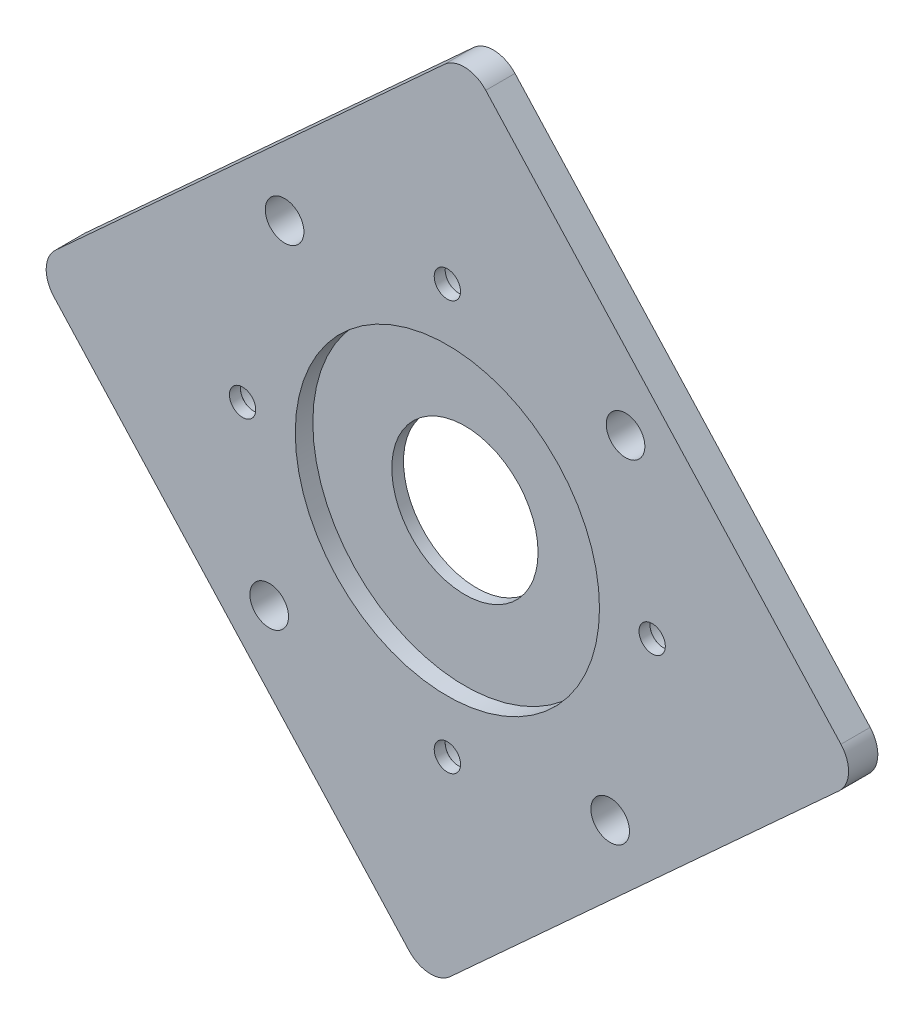
ISO-10303-21;
HEADER;
FILE_DESCRIPTION(('STEP AP214'),'2;1');
FILE_NAME('part.step','',(''),(''),'','','');
FILE_SCHEMA(('AUTOMOTIVE_DESIGN { 1 0 10303 214 1 1 1 1 }'));
ENDSEC;
DATA;
#1=APPLICATION_CONTEXT('core data for automotive mechanical design processes');
#2=APPLICATION_PROTOCOL_DEFINITION('international standard','automotive_design',2000,#1);
#3=PRODUCT_CONTEXT('',#1,'mechanical');
#4=PRODUCT('Part','Part','',(#3));
#5=PRODUCT_RELATED_PRODUCT_CATEGORY('part','',(#4));
#6=PRODUCT_DEFINITION_FORMATION('','',#4);
#7=PRODUCT_DEFINITION_CONTEXT('part definition',#1,'design');
#8=PRODUCT_DEFINITION('design','',#6,#7);
#9=PRODUCT_DEFINITION_SHAPE('','',#8);
#10=(LENGTH_UNIT() NAMED_UNIT(*) SI_UNIT(.MILLI.,.METRE.));
#11=(NAMED_UNIT(*) PLANE_ANGLE_UNIT() SI_UNIT($,.RADIAN.));
#12=(NAMED_UNIT(*) SI_UNIT($,.STERADIAN.) SOLID_ANGLE_UNIT());
#13=UNCERTAINTY_MEASURE_WITH_UNIT(LENGTH_MEASURE(1.E-05),#10,'distance_accuracy_value','');
#14=(GEOMETRIC_REPRESENTATION_CONTEXT(3) GLOBAL_UNCERTAINTY_ASSIGNED_CONTEXT((#13)) GLOBAL_UNIT_ASSIGNED_CONTEXT((#10,
#11,#12)) REPRESENTATION_CONTEXT('',''));
#15=CARTESIAN_POINT('',(0.,0.,0.));
#16=DIRECTION('',(0.,0.,1.));
#17=DIRECTION('',(1.,0.,0.));
#18=AXIS2_PLACEMENT_3D('',#15,#16,#17);
#19=CARTESIAN_POINT('',(0.,0.,5.));
#20=DIRECTION('',(0.,0.,1.));
#21=DIRECTION('',(1.,0.,0.));
#22=AXIS2_PLACEMENT_3D('',#19,#20,#21);
#23=PLANE('',#22);
#24=CARTESIAN_POINT('',(30.4526604909076,27.8244131838484,5.));
#25=DIRECTION('',(0.,0.,1.));
#26=DIRECTION('',(1.,0.,0.));
#27=AXIS2_PLACEMENT_3D('',#24,#25,#26);
#28=CIRCLE('',#27,3.29999999999998);
#29=CARTESIAN_POINT('',(33.7526604909076,27.8244131838484,5.));
#30=VERTEX_POINT('',#29);
#31=EDGE_CURVE('E177',#30,#30,#28,.T.);
#32=ORIENTED_EDGE('',*,*,#31,.F.);
#33=EDGE_LOOP('',(#32));
#34=FACE_BOUND('',#33,.T.);
#35=CARTESIAN_POINT('',(-27.8244131838484,30.4526604909076,5.));
#36=DIRECTION('',(0.,0.,1.));
#37=DIRECTION('',(1.,0.,0.));
#38=AXIS2_PLACEMENT_3D('',#35,#36,#37);
#39=CIRCLE('',#38,3.29999999999999);
#40=CARTESIAN_POINT('',(-24.5244131838484,30.4526604909076,5.));
#41=VERTEX_POINT('',#40);
#42=EDGE_CURVE('E184',#41,#41,#39,.T.);
#43=ORIENTED_EDGE('',*,*,#42,.F.);
#44=EDGE_LOOP('',(#43));
#45=FACE_BOUND('',#44,.T.);
#46=CARTESIAN_POINT('',(-30.4526604909076,-27.8244131838484,5.));
#47=DIRECTION('',(0.,0.,1.));
#48=DIRECTION('',(1.,0.,0.));
#49=AXIS2_PLACEMENT_3D('',#46,#47,#48);
#50=CIRCLE('',#49,3.29999999999999);
#51=CARTESIAN_POINT('',(-27.1526604909076,-27.8244131838484,5.));
#52=VERTEX_POINT('',#51);
#53=EDGE_CURVE('E190',#52,#52,#50,.T.);
#54=ORIENTED_EDGE('',*,*,#53,.F.);
#55=EDGE_LOOP('',(#54));
#56=FACE_BOUND('',#55,.T.);
#57=CARTESIAN_POINT('',(27.8244131838484,-30.4526604909076,5.));
#58=DIRECTION('',(0.,0.,1.));
#59=DIRECTION('',(1.,0.,0.));
#60=AXIS2_PLACEMENT_3D('',#57,#58,#59);
#61=CIRCLE('',#60,3.29999999999999);
#62=CARTESIAN_POINT('',(31.1244131838484,-30.4526604909076,5.));
#63=VERTEX_POINT('',#62);
#64=EDGE_CURVE('E196',#63,#63,#61,.T.);
#65=ORIENTED_EDGE('',*,*,#64,.F.);
#66=EDGE_LOOP('',(#65));
#67=FACE_BOUND('',#66,.T.);
#68=CARTESIAN_POINT('',(0.,35.,5.));
#69=DIRECTION('',(0.,0.,-1.));
#70=DIRECTION('',(-1.,0.,0.));
#71=AXIS2_PLACEMENT_3D('',#68,#69,#70);
#72=CIRCLE('',#71,2.25);
#73=CARTESIAN_POINT('',(-2.25,35.,5.));
#74=VERTEX_POINT('',#73);
#75=EDGE_CURVE('E214',#74,#74,#72,.T.);
#76=ORIENTED_EDGE('',*,*,#75,.T.);
#77=EDGE_LOOP('',(#76));
#78=FACE_BOUND('',#77,.T.);
#79=CARTESIAN_POINT('',(-35.,0.,5.));
#80=DIRECTION('',(0.,0.,-1.));
#81=DIRECTION('',(-1.,0.,0.));
#82=AXIS2_PLACEMENT_3D('',#79,#80,#81);
#83=CIRCLE('',#82,2.25);
#84=CARTESIAN_POINT('',(-37.25,0.,5.));
#85=VERTEX_POINT('',#84);
#86=EDGE_CURVE('E229',#85,#85,#83,.T.);
#87=ORIENTED_EDGE('',*,*,#86,.T.);
#88=EDGE_LOOP('',(#87));
#89=FACE_BOUND('',#88,.T.);
#90=CARTESIAN_POINT('',(0.,-35.,5.));
#91=DIRECTION('',(0.,0.,-1.));
#92=DIRECTION('',(-1.,0.,0.));
#93=AXIS2_PLACEMENT_3D('',#90,#91,#92);
#94=CIRCLE('',#93,2.25);
#95=CARTESIAN_POINT('',(-2.25,-35.,5.));
#96=VERTEX_POINT('',#95);
#97=EDGE_CURVE('E244',#96,#96,#94,.T.);
#98=ORIENTED_EDGE('',*,*,#97,.T.);
#99=EDGE_LOOP('',(#98));
#100=FACE_BOUND('',#99,.T.);
#101=CARTESIAN_POINT('',(35.,0.,5.));
#102=DIRECTION('',(0.,0.,-1.));
#103=DIRECTION('',(-1.,0.,0.));
#104=AXIS2_PLACEMENT_3D('',#101,#102,#103);
#105=CIRCLE('',#104,2.25);
#106=CARTESIAN_POINT('',(32.75,0.,5.));
#107=VERTEX_POINT('',#106);
#108=EDGE_CURVE('E259',#107,#107,#105,.T.);
#109=ORIENTED_EDGE('',*,*,#108,.T.);
#110=EDGE_LOOP('',(#109));
#111=FACE_BOUND('',#110,.T.);
#112=CARTESIAN_POINT('',(0.,0.,5.));
#113=DIRECTION('',(0.,0.,1.));
#114=DIRECTION('',(1.,0.,0.));
#115=AXIS2_PLACEMENT_3D('',#112,#113,#114);
#116=CIRCLE('',#115,26.);
#117=CARTESIAN_POINT('',(26.,0.,5.));
#118=VERTEX_POINT('',#117);
#119=EDGE_CURVE('E93',#118,#118,#116,.T.);
#120=ORIENTED_EDGE('',*,*,#119,.F.);
#121=EDGE_LOOP('',(#120));
#122=FACE_BOUND('',#121,.T.);
#123=DIRECTION('',(-0.674531228699354,0.738246314931094,0.));
#124=VECTOR('',#123,1.);
#125=CARTESIAN_POINT('',(-36.9123157465547,-33.7265614349677,5.));
#126=LINE('',#125,#124);
#127=CARTESIAN_POINT('',(-6.55841045508376,-66.9476456068669,5.));
#128=VERTEX_POINT('',#127);
#129=CARTESIAN_POINT('',(-67.2662210380256,-0.505477263068529,5.));
#130=VERTEX_POINT('',#129);
#131=EDGE_CURVE('E161',#128,#130,#126,.T.);
#132=ORIENTED_EDGE('',*,*,#131,.F.);
#133=CARTESIAN_POINT('',(-2.86717888042828,-63.5749894633702,5.));
#134=DIRECTION('',(0.,0.,-1.));
#135=DIRECTION('',(-1.,0.,0.));
#136=AXIS2_PLACEMENT_3D('',#133,#134,#135);
#137=CIRCLE('',#136,5.);
#138=CARTESIAN_POINT('',(0.505477263068516,-67.2662210380256,5.));
#139=VERTEX_POINT('',#138);
#140=EDGE_CURVE('E361',#139,#128,#137,.T.);
#141=ORIENTED_EDGE('',*,*,#140,.F.);
#142=DIRECTION('',(-0.738246314931094,-0.674531228699354,0.));
#143=VECTOR('',#142,1.);
#144=CARTESIAN_POINT('',(33.7265614349677,-36.9123157465547,5.));
#145=LINE('',#144,#143);
#146=CARTESIAN_POINT('',(66.9476456068669,-6.55841045508376,5.));
#147=VERTEX_POINT('',#146);
#148=EDGE_CURVE('E357',#147,#139,#145,.T.);
#149=ORIENTED_EDGE('',*,*,#148,.F.);
#150=CARTESIAN_POINT('',(63.5749894633702,-2.86717888042828,5.));
#151=DIRECTION('',(0.,0.,-1.));
#152=DIRECTION('',(-1.,0.,0.));
#153=AXIS2_PLACEMENT_3D('',#150,#151,#152);
#154=CIRCLE('',#153,4.99999999999999);
#155=CARTESIAN_POINT('',(67.2662210380256,0.505477263068516,5.));
#156=VERTEX_POINT('',#155);
#157=EDGE_CURVE('E152',#156,#147,#154,.T.);
#158=ORIENTED_EDGE('',*,*,#157,.F.);
#159=DIRECTION('',(0.674531228699354,-0.738246314931094,0.));
#160=VECTOR('',#159,1.);
#161=CARTESIAN_POINT('',(36.9123157465547,33.7265614349677,5.));
#162=LINE('',#161,#160);
#163=CARTESIAN_POINT('',(6.55841045508377,66.9476456068669,5.));
#164=VERTEX_POINT('',#163);
#165=EDGE_CURVE('E138',#164,#156,#162,.T.);
#166=ORIENTED_EDGE('',*,*,#165,.F.);
#167=CARTESIAN_POINT('',(2.86717888042827,63.5749894633701,5.));
#168=DIRECTION('',(0.,0.,-1.));
#169=DIRECTION('',(-1.,0.,0.));
#170=AXIS2_PLACEMENT_3D('',#167,#168,#169);
#171=CIRCLE('',#170,4.99999999999999);
#172=CARTESIAN_POINT('',(-0.505477263068522,67.2662210380256,5.));
#173=VERTEX_POINT('',#172);
#174=EDGE_CURVE('E144',#173,#164,#171,.T.);
#175=ORIENTED_EDGE('',*,*,#174,.F.);
#176=DIRECTION('',(0.738246314931094,0.674531228699354,0.));
#177=VECTOR('',#176,1.);
#178=CARTESIAN_POINT('',(-33.7265614349677,36.9123157465547,5.));
#179=LINE('',#178,#177);
#180=CARTESIAN_POINT('',(-66.9476456068669,6.55841045508377,5.));
#181=VERTEX_POINT('',#180);
#182=EDGE_CURVE('E167',#181,#173,#179,.T.);
#183=ORIENTED_EDGE('',*,*,#182,.F.);
#184=CARTESIAN_POINT('',(-63.5749894633702,2.86717888042827,5.));
#185=DIRECTION('',(0.,0.,-1.));
#186=DIRECTION('',(-1.,0.,0.));
#187=AXIS2_PLACEMENT_3D('',#184,#185,#186);
#188=CIRCLE('',#187,4.99999999999999);
#189=EDGE_CURVE('E163',#130,#181,#188,.T.);
#190=ORIENTED_EDGE('',*,*,#189,.F.);
#191=EDGE_LOOP('',(#132,#141,#149,#158,#166,#175,#183,#190));
#192=FACE_BOUND('',#191,.T.);
#193=ADVANCED_FACE('F83',(#34,#45,#56,#67,#78,#89,#100,#111,#122,#192),#23,.T.);
#194=CARTESIAN_POINT('',(0.,0.,0.));
#195=DIRECTION('',(0.,0.,1.));
#196=DIRECTION('',(1.,0.,0.));
#197=AXIS2_PLACEMENT_3D('',#194,#195,#196);
#198=PLANE('',#197);
#199=CARTESIAN_POINT('',(30.4526604909076,27.8244131838484,0.));
#200=DIRECTION('',(0.,0.,1.));
#201=DIRECTION('',(1.,0.,0.));
#202=AXIS2_PLACEMENT_3D('',#199,#200,#201);
#203=CIRCLE('',#202,3.29999999999998);
#204=CARTESIAN_POINT('',(33.7526604909076,27.8244131838484,0.));
#205=VERTEX_POINT('',#204);
#206=EDGE_CURVE('E181',#205,#205,#203,.T.);
#207=ORIENTED_EDGE('',*,*,#206,.T.);
#208=EDGE_LOOP('',(#207));
#209=FACE_BOUND('',#208,.T.);
#210=CARTESIAN_POINT('',(-27.8244131838484,30.4526604909076,0.));
#211=DIRECTION('',(0.,0.,1.));
#212=DIRECTION('',(1.,0.,0.));
#213=AXIS2_PLACEMENT_3D('',#210,#211,#212);
#214=CIRCLE('',#213,3.29999999999999);
#215=CARTESIAN_POINT('',(-24.5244131838484,30.4526604909076,0.));
#216=VERTEX_POINT('',#215);
#217=EDGE_CURVE('E187',#216,#216,#214,.T.);
#218=ORIENTED_EDGE('',*,*,#217,.T.);
#219=EDGE_LOOP('',(#218));
#220=FACE_BOUND('',#219,.T.);
#221=CARTESIAN_POINT('',(-30.4526604909076,-27.8244131838484,0.));
#222=DIRECTION('',(0.,0.,1.));
#223=DIRECTION('',(1.,0.,0.));
#224=AXIS2_PLACEMENT_3D('',#221,#222,#223);
#225=CIRCLE('',#224,3.29999999999999);
#226=CARTESIAN_POINT('',(-27.1526604909076,-27.8244131838484,0.));
#227=VERTEX_POINT('',#226);
#228=EDGE_CURVE('E193',#227,#227,#225,.T.);
#229=ORIENTED_EDGE('',*,*,#228,.T.);
#230=EDGE_LOOP('',(#229));
#231=FACE_BOUND('',#230,.T.);
#232=CARTESIAN_POINT('',(27.8244131838484,-30.4526604909076,0.));
#233=DIRECTION('',(0.,0.,1.));
#234=DIRECTION('',(1.,0.,0.));
#235=AXIS2_PLACEMENT_3D('',#232,#233,#234);
#236=CIRCLE('',#235,3.29999999999999);
#237=CARTESIAN_POINT('',(31.1244131838484,-30.4526604909076,0.));
#238=VERTEX_POINT('',#237);
#239=EDGE_CURVE('E199',#238,#238,#236,.T.);
#240=ORIENTED_EDGE('',*,*,#239,.T.);
#241=EDGE_LOOP('',(#240));
#242=FACE_BOUND('',#241,.T.);
#243=CARTESIAN_POINT('',(0.,35.,0.));
#244=DIRECTION('',(0.,0.,-1.));
#245=DIRECTION('',(-1.,0.,0.));
#246=AXIS2_PLACEMENT_3D('',#243,#244,#245);
#247=CIRCLE('',#246,4.5);
#248=CARTESIAN_POINT('',(-4.5,35.,0.));
#249=VERTEX_POINT('',#248);
#250=EDGE_CURVE('E202',#249,#249,#247,.T.);
#251=ORIENTED_EDGE('',*,*,#250,.F.);
#252=EDGE_LOOP('',(#251));
#253=FACE_BOUND('',#252,.T.);
#254=CARTESIAN_POINT('',(-35.,0.,0.));
#255=DIRECTION('',(0.,0.,-1.));
#256=DIRECTION('',(-1.,0.,0.));
#257=AXIS2_PLACEMENT_3D('',#254,#255,#256);
#258=CIRCLE('',#257,4.5);
#259=CARTESIAN_POINT('',(-39.5,0.,0.));
#260=VERTEX_POINT('',#259);
#261=EDGE_CURVE('E217',#260,#260,#258,.T.);
#262=ORIENTED_EDGE('',*,*,#261,.F.);
#263=EDGE_LOOP('',(#262));
#264=FACE_BOUND('',#263,.T.);
#265=CARTESIAN_POINT('',(0.,-35.,0.));
#266=DIRECTION('',(0.,0.,-1.));
#267=DIRECTION('',(-1.,0.,0.));
#268=AXIS2_PLACEMENT_3D('',#265,#266,#267);
#269=CIRCLE('',#268,4.5);
#270=CARTESIAN_POINT('',(-4.5,-35.,0.));
#271=VERTEX_POINT('',#270);
#272=EDGE_CURVE('E232',#271,#271,#269,.T.);
#273=ORIENTED_EDGE('',*,*,#272,.F.);
#274=EDGE_LOOP('',(#273));
#275=FACE_BOUND('',#274,.T.);
#276=CARTESIAN_POINT('',(35.,0.,0.));
#277=DIRECTION('',(0.,0.,-1.));
#278=DIRECTION('',(-1.,0.,0.));
#279=AXIS2_PLACEMENT_3D('',#276,#277,#278);
#280=CIRCLE('',#279,4.5);
#281=CARTESIAN_POINT('',(30.5,0.,0.));
#282=VERTEX_POINT('',#281);
#283=EDGE_CURVE('E247',#282,#282,#280,.T.);
#284=ORIENTED_EDGE('',*,*,#283,.F.);
#285=EDGE_LOOP('',(#284));
#286=FACE_BOUND('',#285,.T.);
#287=CARTESIAN_POINT('',(0.,0.,0.));
#288=DIRECTION('',(0.,0.,1.));
#289=DIRECTION('',(1.,0.,0.));
#290=AXIS2_PLACEMENT_3D('',#287,#288,#289);
#291=CIRCLE('',#290,12.5);
#292=CARTESIAN_POINT('',(12.5,0.,0.));
#293=VERTEX_POINT('',#292);
#294=EDGE_CURVE('E262',#293,#293,#291,.T.);
#295=ORIENTED_EDGE('',*,*,#294,.T.);
#296=EDGE_LOOP('',(#295));
#297=FACE_BOUND('',#296,.T.);
#298=DIRECTION('',(-0.738246314931094,-0.674531228699354,0.));
#299=VECTOR('',#298,1.);
#300=CARTESIAN_POINT('',(33.7265614349677,-36.9123157465547,0.));
#301=LINE('',#300,#299);
#302=CARTESIAN_POINT('',(66.9476456068669,-6.55841045508376,0.));
#303=VERTEX_POINT('',#302);
#304=CARTESIAN_POINT('',(0.505477263068516,-67.2662210380256,0.));
#305=VERTEX_POINT('',#304);
#306=EDGE_CURVE('E340',#303,#305,#301,.T.);
#307=ORIENTED_EDGE('',*,*,#306,.T.);
#308=CARTESIAN_POINT('',(-2.86717888042828,-63.5749894633702,0.));
#309=DIRECTION('',(0.,0.,-1.));
#310=DIRECTION('',(-1.,0.,0.));
#311=AXIS2_PLACEMENT_3D('',#308,#309,#310);
#312=CIRCLE('',#311,5.);
#313=CARTESIAN_POINT('',(-6.55841045508376,-66.9476456068669,0.));
#314=VERTEX_POINT('',#313);
#315=EDGE_CURVE('E344',#305,#314,#312,.T.);
#316=ORIENTED_EDGE('',*,*,#315,.T.);
#317=DIRECTION('',(-0.674531228699354,0.738246314931094,0.));
#318=VECTOR('',#317,1.);
#319=CARTESIAN_POINT('',(-36.9123157465547,-33.7265614349677,0.));
#320=LINE('',#319,#318);
#321=CARTESIAN_POINT('',(-67.2662210380256,-0.505477263068529,0.));
#322=VERTEX_POINT('',#321);
#323=EDGE_CURVE('E169',#314,#322,#320,.T.);
#324=ORIENTED_EDGE('',*,*,#323,.T.);
#325=CARTESIAN_POINT('',(-63.5749894633702,2.86717888042827,0.));
#326=DIRECTION('',(0.,0.,-1.));
#327=DIRECTION('',(-1.,0.,0.));
#328=AXIS2_PLACEMENT_3D('',#325,#326,#327);
#329=CIRCLE('',#328,4.99999999999999);
#330=CARTESIAN_POINT('',(-66.9476456068669,6.55841045508377,0.));
#331=VERTEX_POINT('',#330);
#332=EDGE_CURVE('E172',#322,#331,#329,.T.);
#333=ORIENTED_EDGE('',*,*,#332,.T.);
#334=DIRECTION('',(0.738246314931094,0.674531228699354,0.));
#335=VECTOR('',#334,1.);
#336=CARTESIAN_POINT('',(-33.7265614349677,36.9123157465547,0.));
#337=LINE('',#336,#335);
#338=CARTESIAN_POINT('',(-0.505477263068522,67.2662210380256,0.));
#339=VERTEX_POINT('',#338);
#340=EDGE_CURVE('E164',#331,#339,#337,.T.);
#341=ORIENTED_EDGE('',*,*,#340,.T.);
#342=CARTESIAN_POINT('',(2.86717888042827,63.5749894633701,0.));
#343=DIRECTION('',(0.,0.,-1.));
#344=DIRECTION('',(-1.,0.,0.));
#345=AXIS2_PLACEMENT_3D('',#342,#343,#344);
#346=CIRCLE('',#345,4.99999999999999);
#347=CARTESIAN_POINT('',(6.55841045508377,66.9476456068669,0.));
#348=VERTEX_POINT('',#347);
#349=EDGE_CURVE('E143',#339,#348,#346,.T.);
#350=ORIENTED_EDGE('',*,*,#349,.T.);
#351=DIRECTION('',(0.674531228699354,-0.738246314931094,0.));
#352=VECTOR('',#351,1.);
#353=CARTESIAN_POINT('',(36.9123157465547,33.7265614349677,0.));
#354=LINE('',#353,#352);
#355=CARTESIAN_POINT('',(67.2662210380256,0.505477263068516,0.));
#356=VERTEX_POINT('',#355);
#357=EDGE_CURVE('E141',#348,#356,#354,.T.);
#358=ORIENTED_EDGE('',*,*,#357,.T.);
#359=CARTESIAN_POINT('',(63.5749894633702,-2.86717888042828,0.));
#360=DIRECTION('',(0.,0.,-1.));
#361=DIRECTION('',(-1.,0.,0.));
#362=AXIS2_PLACEMENT_3D('',#359,#360,#361);
#363=CIRCLE('',#362,4.99999999999999);
#364=EDGE_CURVE('E346',#356,#303,#363,.T.);
#365=ORIENTED_EDGE('',*,*,#364,.T.);
#366=EDGE_LOOP('',(#307,#316,#324,#333,#341,#350,#358,#365));
#367=FACE_BOUND('',#366,.T.);
#368=ADVANCED_FACE('F85',(#209,#220,#231,#242,#253,#264,#275,#286,#297,#367),#198,.F.);
#369=CARTESIAN_POINT('',(0.,0.,2.));
#370=DIRECTION('',(0.,0.,1.));
#371=DIRECTION('',(1.,0.,0.));
#372=AXIS2_PLACEMENT_3D('',#369,#370,#371);
#373=CYLINDRICAL_SURFACE('',#372,26.);
#374=CARTESIAN_POINT('',(0.,0.,2.));
#375=DIRECTION('',(0.,0.,1.));
#376=DIRECTION('',(1.,0.,0.));
#377=AXIS2_PLACEMENT_3D('',#374,#375,#376);
#378=CIRCLE('',#377,26.);
#379=CARTESIAN_POINT('',(26.,0.,2.));
#380=VERTEX_POINT('',#379);
#381=EDGE_CURVE('E12',#380,#380,#378,.T.);
#382=ORIENTED_EDGE('',*,*,#381,.F.);
#383=EDGE_LOOP('',(#382));
#384=FACE_BOUND('',#383,.T.);
#385=ORIENTED_EDGE('',*,*,#119,.T.);
#386=EDGE_LOOP('',(#385));
#387=FACE_BOUND('',#386,.T.);
#388=ADVANCED_FACE('F276',(#384,#387),#373,.F.);
#389=CARTESIAN_POINT('',(0.,0.,2.));
#390=DIRECTION('',(0.,0.,1.));
#391=DIRECTION('',(1.,0.,0.));
#392=AXIS2_PLACEMENT_3D('',#389,#390,#391);
#393=PLANE('',#392);
#394=CARTESIAN_POINT('',(0.,0.,2.));
#395=DIRECTION('',(0.,0.,1.));
#396=DIRECTION('',(1.,0.,0.));
#397=AXIS2_PLACEMENT_3D('',#394,#395,#396);
#398=CIRCLE('',#397,12.5);
#399=CARTESIAN_POINT('',(12.5,0.,2.));
#400=VERTEX_POINT('',#399);
#401=EDGE_CURVE('E87',#400,#400,#398,.T.);
#402=ORIENTED_EDGE('',*,*,#401,.F.);
#403=EDGE_LOOP('',(#402));
#404=FACE_BOUND('',#403,.T.);
#405=ORIENTED_EDGE('',*,*,#381,.T.);
#406=EDGE_LOOP('',(#405));
#407=FACE_BOUND('',#406,.T.);
#408=ADVANCED_FACE('F273',(#404,#407),#393,.T.);
#409=CARTESIAN_POINT('',(0.,0.,0.));
#410=DIRECTION('',(0.,0.,1.));
#411=DIRECTION('',(1.,0.,0.));
#412=AXIS2_PLACEMENT_3D('',#409,#410,#411);
#413=CYLINDRICAL_SURFACE('',#412,12.5);
#414=ORIENTED_EDGE('',*,*,#401,.T.);
#415=EDGE_LOOP('',(#414));
#416=FACE_BOUND('',#415,.T.);
#417=ORIENTED_EDGE('',*,*,#294,.F.);
#418=EDGE_LOOP('',(#417));
#419=FACE_BOUND('',#418,.T.);
#420=ADVANCED_FACE('F270',(#416,#419),#413,.F.);
#421=CARTESIAN_POINT('',(35.,0.,0.));
#422=DIRECTION('',(0.,0.,-1.));
#423=DIRECTION('',(-1.,0.,0.));
#424=AXIS2_PLACEMENT_3D('',#421,#422,#423);
#425=CYLINDRICAL_SURFACE('',#424,2.25);
#426=ORIENTED_EDGE('',*,*,#108,.F.);
#427=EDGE_LOOP('',(#426));
#428=FACE_BOUND('',#427,.T.);
#429=CARTESIAN_POINT('',(35.,0.,3.125));
#430=DIRECTION('',(0.,0.,-1.));
#431=DIRECTION('',(-1.,0.,0.));
#432=AXIS2_PLACEMENT_3D('',#429,#430,#431);
#433=CIRCLE('',#432,2.25);
#434=CARTESIAN_POINT('',(32.75,0.,3.125));
#435=VERTEX_POINT('',#434);
#436=EDGE_CURVE('E256',#435,#435,#433,.T.);
#437=ORIENTED_EDGE('',*,*,#436,.T.);
#438=EDGE_LOOP('',(#437));
#439=FACE_BOUND('',#438,.T.);
#440=ADVANCED_FACE('F307',(#428,#439),#425,.F.);
#441=CARTESIAN_POINT('',(35.,0.,3.1));
#442=DIRECTION('',(0.,0.,-1.));
#443=DIRECTION('',(-1.,0.,0.));
#444=AXIS2_PLACEMENT_3D('',#441,#442,#443);
#445=CONICAL_SURFACE('',#444,2.275,0.785398163397396);
#446=ORIENTED_EDGE('',*,*,#436,.F.);
#447=EDGE_LOOP('',(#446));
#448=FACE_BOUND('',#447,.T.);
#449=CARTESIAN_POINT('',(35.,0.,3.1));
#450=DIRECTION('',(0.,0.,-1.));
#451=DIRECTION('',(-1.,0.,0.));
#452=AXIS2_PLACEMENT_3D('',#449,#450,#451);
#453=CIRCLE('',#452,2.275);
#454=CARTESIAN_POINT('',(32.725,0.,3.1));
#455=VERTEX_POINT('',#454);
#456=EDGE_CURVE('E253',#455,#455,#453,.T.);
#457=ORIENTED_EDGE('',*,*,#456,.T.);
#458=EDGE_LOOP('',(#457));
#459=FACE_BOUND('',#458,.T.);
#460=ADVANCED_FACE('F310',(#448,#459),#445,.F.);
#461=CARTESIAN_POINT('',(37.275,0.,3.1));
#462=DIRECTION('',(0.,0.,1.));
#463=DIRECTION('',(1.,0.,0.));
#464=AXIS2_PLACEMENT_3D('',#461,#462,#463);
#465=PLANE('',#464);
#466=ORIENTED_EDGE('',*,*,#456,.F.);
#467=EDGE_LOOP('',(#466));
#468=FACE_BOUND('',#467,.T.);
#469=CARTESIAN_POINT('',(35.,0.,3.1));
#470=DIRECTION('',(0.,0.,-1.));
#471=DIRECTION('',(-1.,0.,0.));
#472=AXIS2_PLACEMENT_3D('',#469,#470,#471);
#473=CIRCLE('',#472,4.5);
#474=CARTESIAN_POINT('',(30.5,0.,3.1));
#475=VERTEX_POINT('',#474);
#476=EDGE_CURVE('E250',#475,#475,#473,.T.);
#477=ORIENTED_EDGE('',*,*,#476,.T.);
#478=EDGE_LOOP('',(#477));
#479=FACE_BOUND('',#478,.T.);
#480=ADVANCED_FACE('F316',(#468,#479),#465,.F.);
#481=CARTESIAN_POINT('',(35.,0.,0.));
#482=DIRECTION('',(0.,0.,-1.));
#483=DIRECTION('',(-1.,0.,0.));
#484=AXIS2_PLACEMENT_3D('',#481,#482,#483);
#485=CYLINDRICAL_SURFACE('',#484,4.5);
#486=ORIENTED_EDGE('',*,*,#476,.F.);
#487=EDGE_LOOP('',(#486));
#488=FACE_BOUND('',#487,.T.);
#489=ORIENTED_EDGE('',*,*,#283,.T.);
#490=EDGE_LOOP('',(#489));
#491=FACE_BOUND('',#490,.T.);
#492=ADVANCED_FACE('F322',(#488,#491),#485,.F.);
#493=CARTESIAN_POINT('',(0.,-35.,0.));
#494=DIRECTION('',(0.,0.,-1.));
#495=DIRECTION('',(-1.,0.,0.));
#496=AXIS2_PLACEMENT_3D('',#493,#494,#495);
#497=CYLINDRICAL_SURFACE('',#496,2.25);
#498=ORIENTED_EDGE('',*,*,#97,.F.);
#499=EDGE_LOOP('',(#498));
#500=FACE_BOUND('',#499,.T.);
#501=CARTESIAN_POINT('',(0.,-35.,3.125));
#502=DIRECTION('',(0.,0.,-1.));
#503=DIRECTION('',(-1.,0.,0.));
#504=AXIS2_PLACEMENT_3D('',#501,#502,#503);
#505=CIRCLE('',#504,2.25);
#506=CARTESIAN_POINT('',(-2.25,-35.,3.125));
#507=VERTEX_POINT('',#506);
#508=EDGE_CURVE('E241',#507,#507,#505,.T.);
#509=ORIENTED_EDGE('',*,*,#508,.T.);
#510=EDGE_LOOP('',(#509));
#511=FACE_BOUND('',#510,.T.);
#512=ADVANCED_FACE('F328',(#500,#511),#497,.F.);
#513=CARTESIAN_POINT('',(0.,-35.,3.1));
#514=DIRECTION('',(0.,0.,-1.));
#515=DIRECTION('',(-1.,0.,0.));
#516=AXIS2_PLACEMENT_3D('',#513,#514,#515);
#517=CONICAL_SURFACE('',#516,2.275,0.785398163397448);
#518=ORIENTED_EDGE('',*,*,#508,.F.);
#519=EDGE_LOOP('',(#518));
#520=FACE_BOUND('',#519,.T.);
#521=CARTESIAN_POINT('',(0.,-35.,3.1));
#522=DIRECTION('',(0.,0.,-1.));
#523=DIRECTION('',(-1.,0.,0.));
#524=AXIS2_PLACEMENT_3D('',#521,#522,#523);
#525=CIRCLE('',#524,2.275);
#526=CARTESIAN_POINT('',(-2.275,-35.,3.1));
#527=VERTEX_POINT('',#526);
#528=EDGE_CURVE('E238',#527,#527,#525,.T.);
#529=ORIENTED_EDGE('',*,*,#528,.T.);
#530=EDGE_LOOP('',(#529));
#531=FACE_BOUND('',#530,.T.);
#532=ADVANCED_FACE('F468',(#520,#531),#517,.F.);
#533=CARTESIAN_POINT('',(2.275,-35.,3.1));
#534=DIRECTION('',(0.,0.,1.));
#535=DIRECTION('',(1.,0.,0.));
#536=AXIS2_PLACEMENT_3D('',#533,#534,#535);
#537=PLANE('',#536);
#538=ORIENTED_EDGE('',*,*,#528,.F.);
#539=EDGE_LOOP('',(#538));
#540=FACE_BOUND('',#539,.T.);
#541=CARTESIAN_POINT('',(0.,-35.,3.1));
#542=DIRECTION('',(0.,0.,-1.));
#543=DIRECTION('',(-1.,0.,0.));
#544=AXIS2_PLACEMENT_3D('',#541,#542,#543);
#545=CIRCLE('',#544,4.5);
#546=CARTESIAN_POINT('',(-4.5,-35.,3.1));
#547=VERTEX_POINT('',#546);
#548=EDGE_CURVE('E235',#547,#547,#545,.T.);
#549=ORIENTED_EDGE('',*,*,#548,.T.);
#550=EDGE_LOOP('',(#549));
#551=FACE_BOUND('',#550,.T.);
#552=ADVANCED_FACE('F464',(#540,#551),#537,.F.);
#553=CARTESIAN_POINT('',(0.,-35.,0.));
#554=DIRECTION('',(0.,0.,-1.));
#555=DIRECTION('',(-1.,0.,0.));
#556=AXIS2_PLACEMENT_3D('',#553,#554,#555);
#557=CYLINDRICAL_SURFACE('',#556,4.5);
#558=ORIENTED_EDGE('',*,*,#548,.F.);
#559=EDGE_LOOP('',(#558));
#560=FACE_BOUND('',#559,.T.);
#561=ORIENTED_EDGE('',*,*,#272,.T.);
#562=EDGE_LOOP('',(#561));
#563=FACE_BOUND('',#562,.T.);
#564=ADVANCED_FACE('F460',(#560,#563),#557,.F.);
#565=CARTESIAN_POINT('',(-35.,0.,0.));
#566=DIRECTION('',(0.,0.,-1.));
#567=DIRECTION('',(-1.,0.,0.));
#568=AXIS2_PLACEMENT_3D('',#565,#566,#567);
#569=CYLINDRICAL_SURFACE('',#568,2.25);
#570=ORIENTED_EDGE('',*,*,#86,.F.);
#571=EDGE_LOOP('',(#570));
#572=FACE_BOUND('',#571,.T.);
#573=CARTESIAN_POINT('',(-35.,0.,3.125));
#574=DIRECTION('',(0.,0.,-1.));
#575=DIRECTION('',(-1.,0.,0.));
#576=AXIS2_PLACEMENT_3D('',#573,#574,#575);
#577=CIRCLE('',#576,2.25);
#578=CARTESIAN_POINT('',(-37.25,0.,3.125));
#579=VERTEX_POINT('',#578);
#580=EDGE_CURVE('E226',#579,#579,#577,.T.);
#581=ORIENTED_EDGE('',*,*,#580,.T.);
#582=EDGE_LOOP('',(#581));
#583=FACE_BOUND('',#582,.T.);
#584=ADVANCED_FACE('F456',(#572,#583),#569,.F.);
#585=CARTESIAN_POINT('',(-35.,0.,3.1));
#586=DIRECTION('',(0.,0.,-1.));
#587=DIRECTION('',(-1.,0.,0.));
#588=AXIS2_PLACEMENT_3D('',#585,#586,#587);
#589=CONICAL_SURFACE('',#588,2.275,0.785398163397396);
#590=ORIENTED_EDGE('',*,*,#580,.F.);
#591=EDGE_LOOP('',(#590));
#592=FACE_BOUND('',#591,.T.);
#593=CARTESIAN_POINT('',(-35.,0.,3.1));
#594=DIRECTION('',(0.,0.,-1.));
#595=DIRECTION('',(-1.,0.,0.));
#596=AXIS2_PLACEMENT_3D('',#593,#594,#595);
#597=CIRCLE('',#596,2.275);
#598=CARTESIAN_POINT('',(-37.275,0.,3.1));
#599=VERTEX_POINT('',#598);
#600=EDGE_CURVE('E223',#599,#599,#597,.T.);
#601=ORIENTED_EDGE('',*,*,#600,.T.);
#602=EDGE_LOOP('',(#601));
#603=FACE_BOUND('',#602,.T.);
#604=ADVANCED_FACE('F452',(#592,#603),#589,.F.);
#605=CARTESIAN_POINT('',(-32.725,0.,3.1));
#606=DIRECTION('',(0.,0.,1.));
#607=DIRECTION('',(1.,0.,0.));
#608=AXIS2_PLACEMENT_3D('',#605,#606,#607);
#609=PLANE('',#608);
#610=ORIENTED_EDGE('',*,*,#600,.F.);
#611=EDGE_LOOP('',(#610));
#612=FACE_BOUND('',#611,.T.);
#613=CARTESIAN_POINT('',(-35.,0.,3.1));
#614=DIRECTION('',(0.,0.,-1.));
#615=DIRECTION('',(-1.,0.,0.));
#616=AXIS2_PLACEMENT_3D('',#613,#614,#615);
#617=CIRCLE('',#616,4.5);
#618=CARTESIAN_POINT('',(-39.5,0.,3.1));
#619=VERTEX_POINT('',#618);
#620=EDGE_CURVE('E220',#619,#619,#617,.T.);
#621=ORIENTED_EDGE('',*,*,#620,.T.);
#622=EDGE_LOOP('',(#621));
#623=FACE_BOUND('',#622,.T.);
#624=ADVANCED_FACE('F448',(#612,#623),#609,.F.);
#625=CARTESIAN_POINT('',(-35.,0.,0.));
#626=DIRECTION('',(0.,0.,-1.));
#627=DIRECTION('',(-1.,0.,0.));
#628=AXIS2_PLACEMENT_3D('',#625,#626,#627);
#629=CYLINDRICAL_SURFACE('',#628,4.5);
#630=ORIENTED_EDGE('',*,*,#620,.F.);
#631=EDGE_LOOP('',(#630));
#632=FACE_BOUND('',#631,.T.);
#633=ORIENTED_EDGE('',*,*,#261,.T.);
#634=EDGE_LOOP('',(#633));
#635=FACE_BOUND('',#634,.T.);
#636=ADVANCED_FACE('F444',(#632,#635),#629,.F.);
#637=CARTESIAN_POINT('',(0.,35.,0.));
#638=DIRECTION('',(0.,0.,-1.));
#639=DIRECTION('',(-1.,0.,0.));
#640=AXIS2_PLACEMENT_3D('',#637,#638,#639);
#641=CYLINDRICAL_SURFACE('',#640,2.25);
#642=ORIENTED_EDGE('',*,*,#75,.F.);
#643=EDGE_LOOP('',(#642));
#644=FACE_BOUND('',#643,.T.);
#645=CARTESIAN_POINT('',(0.,35.,3.125));
#646=DIRECTION('',(0.,0.,-1.));
#647=DIRECTION('',(-1.,0.,0.));
#648=AXIS2_PLACEMENT_3D('',#645,#646,#647);
#649=CIRCLE('',#648,2.25);
#650=CARTESIAN_POINT('',(-2.25,35.,3.125));
#651=VERTEX_POINT('',#650);
#652=EDGE_CURVE('E211',#651,#651,#649,.T.);
#653=ORIENTED_EDGE('',*,*,#652,.T.);
#654=EDGE_LOOP('',(#653));
#655=FACE_BOUND('',#654,.T.);
#656=ADVANCED_FACE('F440',(#644,#655),#641,.F.);
#657=CARTESIAN_POINT('',(0.,35.,3.1));
#658=DIRECTION('',(0.,0.,-1.));
#659=DIRECTION('',(-1.,0.,0.));
#660=AXIS2_PLACEMENT_3D('',#657,#658,#659);
#661=CONICAL_SURFACE('',#660,2.275,0.785398163397448);
#662=ORIENTED_EDGE('',*,*,#652,.F.);
#663=EDGE_LOOP('',(#662));
#664=FACE_BOUND('',#663,.T.);
#665=CARTESIAN_POINT('',(0.,35.,3.1));
#666=DIRECTION('',(0.,0.,-1.));
#667=DIRECTION('',(-1.,0.,0.));
#668=AXIS2_PLACEMENT_3D('',#665,#666,#667);
#669=CIRCLE('',#668,2.275);
#670=CARTESIAN_POINT('',(-2.275,35.,3.1));
#671=VERTEX_POINT('',#670);
#672=EDGE_CURVE('E208',#671,#671,#669,.T.);
#673=ORIENTED_EDGE('',*,*,#672,.T.);
#674=EDGE_LOOP('',(#673));
#675=FACE_BOUND('',#674,.T.);
#676=ADVANCED_FACE('F436',(#664,#675),#661,.F.);
#677=CARTESIAN_POINT('',(2.275,35.,3.1));
#678=DIRECTION('',(0.,0.,1.));
#679=DIRECTION('',(1.,0.,0.));
#680=AXIS2_PLACEMENT_3D('',#677,#678,#679);
#681=PLANE('',#680);
#682=ORIENTED_EDGE('',*,*,#672,.F.);
#683=EDGE_LOOP('',(#682));
#684=FACE_BOUND('',#683,.T.);
#685=CARTESIAN_POINT('',(0.,35.,3.1));
#686=DIRECTION('',(0.,0.,-1.));
#687=DIRECTION('',(-1.,0.,0.));
#688=AXIS2_PLACEMENT_3D('',#685,#686,#687);
#689=CIRCLE('',#688,4.5);
#690=CARTESIAN_POINT('',(-4.5,35.,3.1));
#691=VERTEX_POINT('',#690);
#692=EDGE_CURVE('E205',#691,#691,#689,.T.);
#693=ORIENTED_EDGE('',*,*,#692,.T.);
#694=EDGE_LOOP('',(#693));
#695=FACE_BOUND('',#694,.T.);
#696=ADVANCED_FACE('F432',(#684,#695),#681,.F.);
#697=CARTESIAN_POINT('',(0.,35.,0.));
#698=DIRECTION('',(0.,0.,-1.));
#699=DIRECTION('',(-1.,0.,0.));
#700=AXIS2_PLACEMENT_3D('',#697,#698,#699);
#701=CYLINDRICAL_SURFACE('',#700,4.5);
#702=ORIENTED_EDGE('',*,*,#692,.F.);
#703=EDGE_LOOP('',(#702));
#704=FACE_BOUND('',#703,.T.);
#705=ORIENTED_EDGE('',*,*,#250,.T.);
#706=EDGE_LOOP('',(#705));
#707=FACE_BOUND('',#706,.T.);
#708=ADVANCED_FACE('F428',(#704,#707),#701,.F.);
#709=CARTESIAN_POINT('',(27.8244131838484,-30.4526604909076,5.));
#710=DIRECTION('',(0.,0.,1.));
#711=DIRECTION('',(1.,0.,0.));
#712=AXIS2_PLACEMENT_3D('',#709,#710,#711);
#713=CYLINDRICAL_SURFACE('',#712,3.29999999999999);
#714=ORIENTED_EDGE('',*,*,#239,.F.);
#715=EDGE_LOOP('',(#714));
#716=FACE_BOUND('',#715,.T.);
#717=ORIENTED_EDGE('',*,*,#64,.T.);
#718=EDGE_LOOP('',(#717));
#719=FACE_BOUND('',#718,.T.);
#720=ADVANCED_FACE('F424',(#716,#719),#713,.F.);
#721=CARTESIAN_POINT('',(-30.4526604909076,-27.8244131838484,5.));
#722=DIRECTION('',(0.,0.,1.));
#723=DIRECTION('',(1.,0.,0.));
#724=AXIS2_PLACEMENT_3D('',#721,#722,#723);
#725=CYLINDRICAL_SURFACE('',#724,3.29999999999999);
#726=ORIENTED_EDGE('',*,*,#228,.F.);
#727=EDGE_LOOP('',(#726));
#728=FACE_BOUND('',#727,.T.);
#729=ORIENTED_EDGE('',*,*,#53,.T.);
#730=EDGE_LOOP('',(#729));
#731=FACE_BOUND('',#730,.T.);
#732=ADVANCED_FACE('F420',(#728,#731),#725,.F.);
#733=CARTESIAN_POINT('',(-27.8244131838484,30.4526604909076,5.));
#734=DIRECTION('',(0.,0.,1.));
#735=DIRECTION('',(1.,0.,0.));
#736=AXIS2_PLACEMENT_3D('',#733,#734,#735);
#737=CYLINDRICAL_SURFACE('',#736,3.29999999999999);
#738=ORIENTED_EDGE('',*,*,#217,.F.);
#739=EDGE_LOOP('',(#738));
#740=FACE_BOUND('',#739,.T.);
#741=ORIENTED_EDGE('',*,*,#42,.T.);
#742=EDGE_LOOP('',(#741));
#743=FACE_BOUND('',#742,.T.);
#744=ADVANCED_FACE('F416',(#740,#743),#737,.F.);
#745=CARTESIAN_POINT('',(30.4526604909076,27.8244131838484,5.));
#746=DIRECTION('',(0.,0.,1.));
#747=DIRECTION('',(1.,0.,0.));
#748=AXIS2_PLACEMENT_3D('',#745,#746,#747);
#749=CYLINDRICAL_SURFACE('',#748,3.29999999999998);
#750=ORIENTED_EDGE('',*,*,#206,.F.);
#751=EDGE_LOOP('',(#750));
#752=FACE_BOUND('',#751,.T.);
#753=ORIENTED_EDGE('',*,*,#31,.T.);
#754=EDGE_LOOP('',(#753));
#755=FACE_BOUND('',#754,.T.);
#756=ADVANCED_FACE('F413',(#752,#755),#749,.F.);
#757=CARTESIAN_POINT('',(-36.9123157465547,-33.7265614349677,5.));
#758=DIRECTION('',(-0.738246314931094,-0.674531228699354,0.));
#759=DIRECTION('',(0.674531228699354,-0.738246314931094,0.));
#760=AXIS2_PLACEMENT_3D('',#757,#758,#759);
#761=PLANE('',#760);
#762=ORIENTED_EDGE('',*,*,#323,.F.);
#763=DIRECTION('',(0.,0.,-1.));
#764=VECTOR('',#763,1.);
#765=CARTESIAN_POINT('',(-6.55841045508376,-66.9476456068669,5.));
#766=LINE('',#765,#764);
#767=EDGE_CURVE('E366',#128,#314,#766,.T.);
#768=ORIENTED_EDGE('',*,*,#767,.F.);
#769=ORIENTED_EDGE('',*,*,#131,.T.);
#770=DIRECTION('',(0.,0.,-1.));
#771=VECTOR('',#770,1.);
#772=CARTESIAN_POINT('',(-67.2662210380256,-0.505477263068529,5.));
#773=LINE('',#772,#771);
#774=EDGE_CURVE('E113',#130,#322,#773,.T.);
#775=ORIENTED_EDGE('',*,*,#774,.T.);
#776=EDGE_LOOP('',(#762,#768,#769,#775));
#777=FACE_BOUND('',#776,.T.);
#778=ADVANCED_FACE('F385',(#777),#761,.T.);
#779=CARTESIAN_POINT('',(-33.7265614349677,36.9123157465547,5.));
#780=DIRECTION('',(-0.674531228699354,0.738246314931094,0.));
#781=DIRECTION('',(-0.738246314931094,-0.674531228699354,0.));
#782=AXIS2_PLACEMENT_3D('',#779,#780,#781);
#783=PLANE('',#782);
#784=ORIENTED_EDGE('',*,*,#340,.F.);
#785=DIRECTION('',(0.,0.,-1.));
#786=VECTOR('',#785,1.);
#787=CARTESIAN_POINT('',(-66.9476456068669,6.55841045508377,5.));
#788=LINE('',#787,#786);
#789=EDGE_CURVE('E102',#181,#331,#788,.T.);
#790=ORIENTED_EDGE('',*,*,#789,.F.);
#791=ORIENTED_EDGE('',*,*,#182,.T.);
#792=DIRECTION('',(0.,0.,-1.));
#793=VECTOR('',#792,1.);
#794=CARTESIAN_POINT('',(-0.505477263068522,67.2662210380256,5.));
#795=LINE('',#794,#793);
#796=EDGE_CURVE('E153',#173,#339,#795,.T.);
#797=ORIENTED_EDGE('',*,*,#796,.T.);
#798=EDGE_LOOP('',(#784,#790,#791,#797));
#799=FACE_BOUND('',#798,.T.);
#800=ADVANCED_FACE('F381',(#799),#783,.T.);
#801=CARTESIAN_POINT('',(-63.5749894633702,2.86717888042827,5.));
#802=DIRECTION('',(0.,0.,-1.));
#803=DIRECTION('',(-1.,0.,0.));
#804=AXIS2_PLACEMENT_3D('',#801,#802,#803);
#805=CYLINDRICAL_SURFACE('',#804,4.99999999999999);
#806=ORIENTED_EDGE('',*,*,#332,.F.);
#807=ORIENTED_EDGE('',*,*,#774,.F.);
#808=ORIENTED_EDGE('',*,*,#189,.T.);
#809=ORIENTED_EDGE('',*,*,#789,.T.);
#810=EDGE_LOOP('',(#806,#807,#808,#809));
#811=FACE_BOUND('',#810,.T.);
#812=ADVANCED_FACE('F384',(#811),#805,.T.);
#813=CARTESIAN_POINT('',(36.9123157465547,33.7265614349677,5.));
#814=DIRECTION('',(0.738246314931094,0.674531228699354,0.));
#815=DIRECTION('',(-0.674531228699354,0.738246314931094,0.));
#816=AXIS2_PLACEMENT_3D('',#813,#814,#815);
#817=PLANE('',#816);
#818=ORIENTED_EDGE('',*,*,#357,.F.);
#819=DIRECTION('',(0.,0.,-1.));
#820=VECTOR('',#819,1.);
#821=CARTESIAN_POINT('',(6.55841045508377,66.9476456068669,5.));
#822=LINE('',#821,#820);
#823=EDGE_CURVE('E122',#164,#348,#822,.T.);
#824=ORIENTED_EDGE('',*,*,#823,.F.);
#825=ORIENTED_EDGE('',*,*,#165,.T.);
#826=DIRECTION('',(0.,0.,-1.));
#827=VECTOR('',#826,1.);
#828=CARTESIAN_POINT('',(67.2662210380256,0.505477263068516,5.));
#829=LINE('',#828,#827);
#830=EDGE_CURVE('E367',#156,#356,#829,.T.);
#831=ORIENTED_EDGE('',*,*,#830,.T.);
#832=EDGE_LOOP('',(#818,#824,#825,#831));
#833=FACE_BOUND('',#832,.T.);
#834=ADVANCED_FACE('F136',(#833),#817,.T.);
#835=CARTESIAN_POINT('',(2.86717888042827,63.5749894633701,5.));
#836=DIRECTION('',(0.,0.,-1.));
#837=DIRECTION('',(-1.,0.,0.));
#838=AXIS2_PLACEMENT_3D('',#835,#836,#837);
#839=CYLINDRICAL_SURFACE('',#838,4.99999999999999);
#840=ORIENTED_EDGE('',*,*,#349,.F.);
#841=ORIENTED_EDGE('',*,*,#796,.F.);
#842=ORIENTED_EDGE('',*,*,#174,.T.);
#843=ORIENTED_EDGE('',*,*,#823,.T.);
#844=EDGE_LOOP('',(#840,#841,#842,#843));
#845=FACE_BOUND('',#844,.T.);
#846=ADVANCED_FACE('F156',(#845),#839,.T.);
#847=CARTESIAN_POINT('',(33.7265614349677,-36.9123157465547,5.));
#848=DIRECTION('',(0.674531228699354,-0.738246314931094,0.));
#849=DIRECTION('',(0.738246314931094,0.674531228699354,0.));
#850=AXIS2_PLACEMENT_3D('',#847,#848,#849);
#851=PLANE('',#850);
#852=ORIENTED_EDGE('',*,*,#306,.F.);
#853=DIRECTION('',(0.,0.,-1.));
#854=VECTOR('',#853,1.);
#855=CARTESIAN_POINT('',(66.9476456068669,-6.55841045508376,5.));
#856=LINE('',#855,#854);
#857=EDGE_CURVE('E373',#147,#303,#856,.T.);
#858=ORIENTED_EDGE('',*,*,#857,.F.);
#859=ORIENTED_EDGE('',*,*,#148,.T.);
#860=DIRECTION('',(0.,0.,-1.));
#861=VECTOR('',#860,1.);
#862=CARTESIAN_POINT('',(0.505477263068516,-67.2662210380256,5.));
#863=LINE('',#862,#861);
#864=EDGE_CURVE('E354',#139,#305,#863,.T.);
#865=ORIENTED_EDGE('',*,*,#864,.T.);
#866=EDGE_LOOP('',(#852,#858,#859,#865));
#867=FACE_BOUND('',#866,.T.);
#868=ADVANCED_FACE('F355',(#867),#851,.T.);
#869=CARTESIAN_POINT('',(63.5749894633702,-2.86717888042828,5.));
#870=DIRECTION('',(0.,0.,-1.));
#871=DIRECTION('',(-1.,0.,0.));
#872=AXIS2_PLACEMENT_3D('',#869,#870,#871);
#873=CYLINDRICAL_SURFACE('',#872,4.99999999999999);
#874=ORIENTED_EDGE('',*,*,#364,.F.);
#875=ORIENTED_EDGE('',*,*,#830,.F.);
#876=ORIENTED_EDGE('',*,*,#157,.T.);
#877=ORIENTED_EDGE('',*,*,#857,.T.);
#878=EDGE_LOOP('',(#874,#875,#876,#877));
#879=FACE_BOUND('',#878,.T.);
#880=ADVANCED_FACE('F393',(#879),#873,.T.);
#881=CARTESIAN_POINT('',(-2.86717888042828,-63.5749894633702,5.));
#882=DIRECTION('',(0.,0.,-1.));
#883=DIRECTION('',(-1.,0.,0.));
#884=AXIS2_PLACEMENT_3D('',#881,#882,#883);
#885=CYLINDRICAL_SURFACE('',#884,5.);
#886=ORIENTED_EDGE('',*,*,#315,.F.);
#887=ORIENTED_EDGE('',*,*,#864,.F.);
#888=ORIENTED_EDGE('',*,*,#140,.T.);
#889=ORIENTED_EDGE('',*,*,#767,.T.);
#890=EDGE_LOOP('',(#886,#887,#888,#889));
#891=FACE_BOUND('',#890,.T.);
#892=ADVANCED_FACE('F364',(#891),#885,.T.);
#893=CLOSED_SHELL('',(#193,#368,#388,#408,#420,#440,#460,#480,#492,#512,#532,#552,#564,#584,
#604,#624,#636,#656,#676,#696,#708,#720,#732,#744,#756,#778,#800,#812,#834,#846,#868,#880,#892));
#894=MANIFOLD_SOLID_BREP('B2',#893);
#895=ADVANCED_BREP_SHAPE_REPRESENTATION('',(#18,#894),#14);
#896=SHAPE_DEFINITION_REPRESENTATION(#9,#895);
ENDSEC;
END-ISO-10303-21;
